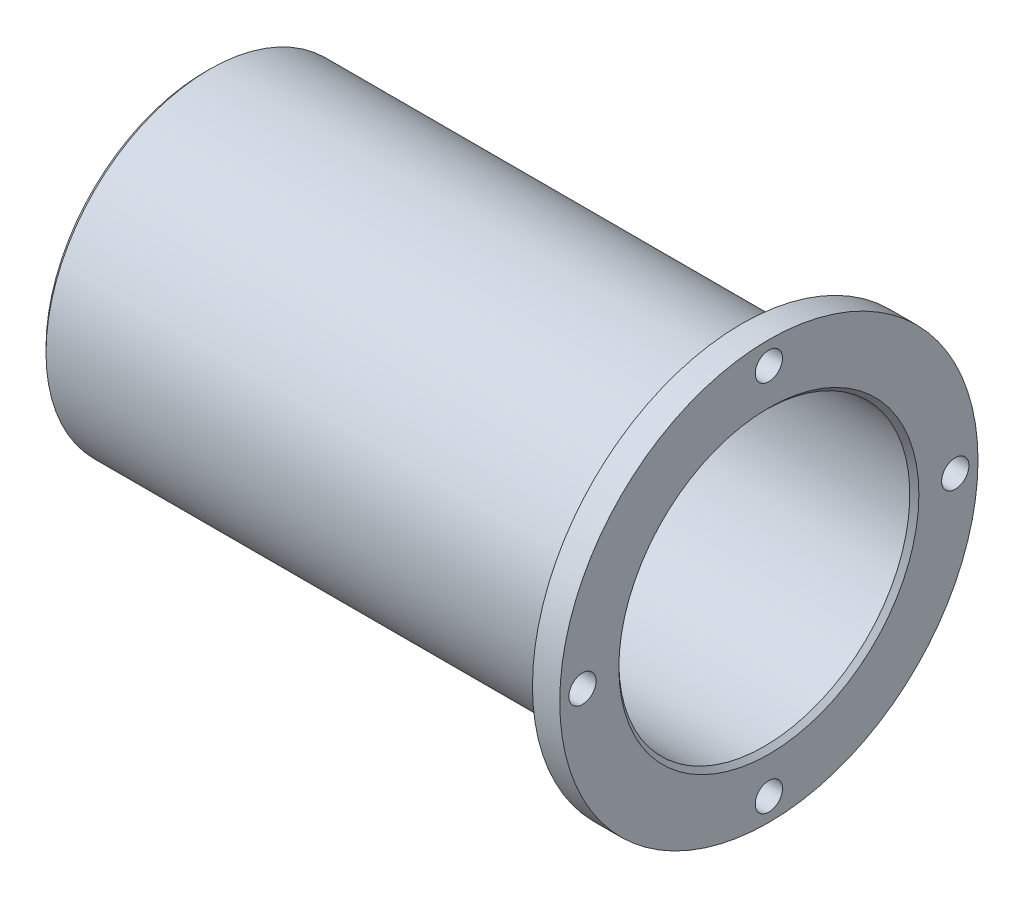
ISO-10303-21;
HEADER;
FILE_DESCRIPTION(('STEP AP214'),'2;1');
FILE_NAME('part.step','',(''),(''),'','','');
FILE_SCHEMA(('AUTOMOTIVE_DESIGN { 1 0 10303 214 1 1 1 1 }'));
ENDSEC;
DATA;
#1=APPLICATION_CONTEXT('core data for automotive mechanical design processes');
#2=APPLICATION_PROTOCOL_DEFINITION('international standard','automotive_design',2000,#1);
#3=PRODUCT_CONTEXT('',#1,'mechanical');
#4=PRODUCT('Part','Part','',(#3));
#5=PRODUCT_RELATED_PRODUCT_CATEGORY('part','',(#4));
#6=PRODUCT_DEFINITION_FORMATION('','',#4);
#7=PRODUCT_DEFINITION_CONTEXT('part definition',#1,'design');
#8=PRODUCT_DEFINITION('design','',#6,#7);
#9=PRODUCT_DEFINITION_SHAPE('','',#8);
#10=(LENGTH_UNIT() NAMED_UNIT(*) SI_UNIT(.MILLI.,.METRE.));
#11=(NAMED_UNIT(*) PLANE_ANGLE_UNIT() SI_UNIT($,.RADIAN.));
#12=(NAMED_UNIT(*) SI_UNIT($,.STERADIAN.) SOLID_ANGLE_UNIT());
#13=UNCERTAINTY_MEASURE_WITH_UNIT(LENGTH_MEASURE(1.E-05),#10,'distance_accuracy_value','');
#14=(GEOMETRIC_REPRESENTATION_CONTEXT(3) GLOBAL_UNCERTAINTY_ASSIGNED_CONTEXT((#13)) GLOBAL_UNIT_ASSIGNED_CONTEXT((#10,
#11,#12)) REPRESENTATION_CONTEXT('',''));
#15=CARTESIAN_POINT('',(0.,0.,0.));
#16=DIRECTION('',(0.,0.,1.));
#17=DIRECTION('',(1.,0.,0.));
#18=AXIS2_PLACEMENT_3D('',#15,#16,#17);
#19=CARTESIAN_POINT('',(-69.9562314889052,0.,0.));
#20=DIRECTION('',(-1.,0.,0.));
#21=DIRECTION('',(0.,0.,1.));
#22=AXIS2_PLACEMENT_3D('',#19,#20,#21);
#23=CYLINDRICAL_SURFACE('',#22,18.);
#24=CARTESIAN_POINT('',(-61.5,0.,0.));
#25=DIRECTION('',(1.,0.,0.));
#26=DIRECTION('',(0.,0.,-1.));
#27=AXIS2_PLACEMENT_3D('',#24,#25,#26);
#28=CIRCLE('',#27,18.);
#29=CARTESIAN_POINT('',(-61.5,0.,-18.));
#30=VERTEX_POINT('',#29);
#31=EDGE_CURVE('E10',#30,#30,#28,.T.);
#32=ORIENTED_EDGE('',*,*,#31,.T.);
#33=EDGE_LOOP('',(#32));
#34=FACE_BOUND('',#33,.T.);
#35=CARTESIAN_POINT('',(-3.,0.,0.));
#36=DIRECTION('',(-1.,0.,0.));
#37=DIRECTION('',(0.,0.,1.));
#38=AXIS2_PLACEMENT_3D('',#35,#36,#37);
#39=CIRCLE('',#38,18.);
#40=CARTESIAN_POINT('',(-3.,0.,18.));
#41=VERTEX_POINT('',#40);
#42=EDGE_CURVE('E92',#41,#41,#39,.T.);
#43=ORIENTED_EDGE('',*,*,#42,.T.);
#44=EDGE_LOOP('',(#43));
#45=FACE_BOUND('',#44,.T.);
#46=ADVANCED_FACE('F33',(#34,#45),#23,.T.);
#47=CARTESIAN_POINT('',(-62.,18.,0.));
#48=DIRECTION('',(1.,0.,0.));
#49=DIRECTION('',(0.,0.,-1.));
#50=AXIS2_PLACEMENT_3D('',#47,#48,#49);
#51=PLANE('',#50);
#52=CARTESIAN_POINT('',(-62.,0.,0.));
#53=DIRECTION('',(1.,0.,0.));
#54=DIRECTION('',(0.,0.,-1.));
#55=AXIS2_PLACEMENT_3D('',#52,#53,#54);
#56=CIRCLE('',#55,17.5);
#57=CARTESIAN_POINT('',(-62.,0.,-17.5));
#58=VERTEX_POINT('',#57);
#59=EDGE_CURVE('E40',#58,#58,#56,.F.);
#60=ORIENTED_EDGE('',*,*,#59,.T.);
#61=EDGE_LOOP('',(#60));
#62=FACE_BOUND('',#61,.T.);
#63=CARTESIAN_POINT('',(-62.,-13.,0.));
#64=DIRECTION('',(1.,0.,0.));
#65=DIRECTION('',(0.,0.,-1.));
#66=AXIS2_PLACEMENT_3D('',#63,#64,#65);
#67=CIRCLE('',#66,2.99999999999999);
#68=CARTESIAN_POINT('',(-62.,-13.,-2.99999999999999));
#69=VERTEX_POINT('',#68);
#70=EDGE_CURVE('E62',#69,#69,#67,.T.);
#71=ORIENTED_EDGE('',*,*,#70,.T.);
#72=EDGE_LOOP('',(#71));
#73=FACE_BOUND('',#72,.T.);
#74=CARTESIAN_POINT('',(-62.,0.,13.));
#75=DIRECTION('',(1.,0.,0.));
#76=DIRECTION('',(0.,0.,-1.));
#77=AXIS2_PLACEMENT_3D('',#74,#75,#76);
#78=CIRCLE('',#77,2.99999999999999);
#79=CARTESIAN_POINT('',(-62.,0.,10.));
#80=VERTEX_POINT('',#79);
#81=EDGE_CURVE('E65',#80,#80,#78,.T.);
#82=ORIENTED_EDGE('',*,*,#81,.T.);
#83=EDGE_LOOP('',(#82));
#84=FACE_BOUND('',#83,.T.);
#85=CARTESIAN_POINT('',(-62.,13.,0.));
#86=DIRECTION('',(1.,0.,0.));
#87=DIRECTION('',(0.,0.,-1.));
#88=AXIS2_PLACEMENT_3D('',#85,#86,#87);
#89=CIRCLE('',#88,2.99999999999999);
#90=CARTESIAN_POINT('',(-62.,13.,-2.99999999999999));
#91=VERTEX_POINT('',#90);
#92=EDGE_CURVE('E68',#91,#91,#89,.T.);
#93=ORIENTED_EDGE('',*,*,#92,.T.);
#94=EDGE_LOOP('',(#93));
#95=FACE_BOUND('',#94,.T.);
#96=CARTESIAN_POINT('',(-62.,0.,-13.));
#97=DIRECTION('',(1.,0.,0.));
#98=DIRECTION('',(0.,0.,-1.));
#99=AXIS2_PLACEMENT_3D('',#96,#97,#98);
#100=CIRCLE('',#99,2.99999999999999);
#101=CARTESIAN_POINT('',(-62.,0.,-16.));
#102=VERTEX_POINT('',#101);
#103=EDGE_CURVE('E71',#102,#102,#100,.T.);
#104=ORIENTED_EDGE('',*,*,#103,.T.);
#105=EDGE_LOOP('',(#104));
#106=FACE_BOUND('',#105,.T.);
#107=CARTESIAN_POINT('',(-62.,0.,0.));
#108=DIRECTION('',(-1.,0.,0.));
#109=DIRECTION('',(0.,0.,1.));
#110=AXIS2_PLACEMENT_3D('',#107,#108,#109);
#111=CIRCLE('',#110,9.5);
#112=CARTESIAN_POINT('',(-62.,0.,9.5));
#113=VERTEX_POINT('',#112);
#114=EDGE_CURVE('E77',#113,#113,#111,.T.);
#115=ORIENTED_EDGE('',*,*,#114,.F.);
#116=EDGE_LOOP('',(#115));
#117=FACE_BOUND('',#116,.T.);
#118=ADVANCED_FACE('F162',(#62,#73,#84,#95,#106,#117),#51,.F.);
#119=CARTESIAN_POINT('',(-69.9562314889052,0.,0.));
#120=DIRECTION('',(-1.,0.,0.));
#121=DIRECTION('',(0.,0.,1.));
#122=AXIS2_PLACEMENT_3D('',#119,#120,#121);
#123=CYLINDRICAL_SURFACE('',#122,9.5);
#124=CARTESIAN_POINT('',(-60.,0.,0.));
#125=DIRECTION('',(-1.,0.,0.));
#126=DIRECTION('',(0.,0.,1.));
#127=AXIS2_PLACEMENT_3D('',#124,#125,#126);
#128=CIRCLE('',#127,9.5);
#129=CARTESIAN_POINT('',(-60.,0.,9.5));
#130=VERTEX_POINT('',#129);
#131=EDGE_CURVE('E80',#130,#130,#128,.T.);
#132=ORIENTED_EDGE('',*,*,#131,.F.);
#133=EDGE_LOOP('',(#132));
#134=FACE_BOUND('',#133,.T.);
#135=ORIENTED_EDGE('',*,*,#114,.T.);
#136=EDGE_LOOP('',(#135));
#137=FACE_BOUND('',#136,.T.);
#138=ADVANCED_FACE('F167',(#134,#137),#123,.F.);
#139=CARTESIAN_POINT('',(-60.,16.,0.));
#140=DIRECTION('',(-1.,0.,0.));
#141=DIRECTION('',(0.,0.,1.));
#142=AXIS2_PLACEMENT_3D('',#139,#140,#141);
#143=PLANE('',#142);
#144=CARTESIAN_POINT('',(-60.,13.,0.));
#145=DIRECTION('',(-1.,0.,0.));
#146=DIRECTION('',(0.,0.,1.));
#147=AXIS2_PLACEMENT_3D('',#144,#145,#146);
#148=CIRCLE('',#147,1.5);
#149=CARTESIAN_POINT('',(-60.,13.,1.5));
#150=VERTEX_POINT('',#149);
#151=EDGE_CURVE('E95',#150,#150,#148,.F.);
#152=ORIENTED_EDGE('',*,*,#151,.F.);
#153=EDGE_LOOP('',(#152));
#154=FACE_BOUND('',#153,.T.);
#155=CARTESIAN_POINT('',(-60.,0.,13.));
#156=DIRECTION('',(-1.,0.,0.));
#157=DIRECTION('',(0.,0.,1.));
#158=AXIS2_PLACEMENT_3D('',#155,#156,#157);
#159=CIRCLE('',#158,1.5);
#160=CARTESIAN_POINT('',(-60.,0.,14.5));
#161=VERTEX_POINT('',#160);
#162=EDGE_CURVE('E103',#161,#161,#159,.F.);
#163=ORIENTED_EDGE('',*,*,#162,.F.);
#164=EDGE_LOOP('',(#163));
#165=FACE_BOUND('',#164,.T.);
#166=CARTESIAN_POINT('',(-60.,-13.,0.));
#167=DIRECTION('',(-1.,0.,0.));
#168=DIRECTION('',(0.,0.,1.));
#169=AXIS2_PLACEMENT_3D('',#166,#167,#168);
#170=CIRCLE('',#169,1.5);
#171=CARTESIAN_POINT('',(-60.,-13.,1.5));
#172=VERTEX_POINT('',#171);
#173=EDGE_CURVE('E99',#172,#172,#170,.F.);
#174=ORIENTED_EDGE('',*,*,#173,.F.);
#175=EDGE_LOOP('',(#174));
#176=FACE_BOUND('',#175,.T.);
#177=CARTESIAN_POINT('',(-60.,0.,-13.));
#178=DIRECTION('',(-1.,0.,0.));
#179=DIRECTION('',(0.,0.,1.));
#180=AXIS2_PLACEMENT_3D('',#177,#178,#179);
#181=CIRCLE('',#180,1.5);
#182=CARTESIAN_POINT('',(-60.,0.,-11.5));
#183=VERTEX_POINT('',#182);
#184=EDGE_CURVE('E96',#183,#183,#181,.F.);
#185=ORIENTED_EDGE('',*,*,#184,.F.);
#186=EDGE_LOOP('',(#185));
#187=FACE_BOUND('',#186,.T.);
#188=CARTESIAN_POINT('',(-60.,0.,0.));
#189=DIRECTION('',(-1.,0.,0.));
#190=DIRECTION('',(0.,0.,1.));
#191=AXIS2_PLACEMENT_3D('',#188,#189,#190);
#192=CIRCLE('',#191,16.);
#193=CARTESIAN_POINT('',(-60.,0.,16.));
#194=VERTEX_POINT('',#193);
#195=EDGE_CURVE('E83',#194,#194,#192,.T.);
#196=ORIENTED_EDGE('',*,*,#195,.F.);
#197=EDGE_LOOP('',(#196));
#198=FACE_BOUND('',#197,.T.);
#199=ORIENTED_EDGE('',*,*,#131,.T.);
#200=EDGE_LOOP('',(#199));
#201=FACE_BOUND('',#200,.T.);
#202=ADVANCED_FACE('F205',(#154,#165,#176,#187,#198,#201),#143,.F.);
#203=CARTESIAN_POINT('',(-69.9562314889052,0.,0.));
#204=DIRECTION('',(-1.,0.,0.));
#205=DIRECTION('',(0.,0.,1.));
#206=AXIS2_PLACEMENT_3D('',#203,#204,#205);
#207=CYLINDRICAL_SURFACE('',#206,16.);
#208=CARTESIAN_POINT('',(-0.499999999999987,0.,0.));
#209=DIRECTION('',(-1.,0.,0.));
#210=DIRECTION('',(0.,0.,1.));
#211=AXIS2_PLACEMENT_3D('',#208,#209,#210);
#212=CIRCLE('',#211,16.);
#213=CARTESIAN_POINT('',(-0.499999999999987,0.,16.));
#214=VERTEX_POINT('',#213);
#215=EDGE_CURVE('E44',#214,#214,#212,.F.);
#216=ORIENTED_EDGE('',*,*,#215,.T.);
#217=EDGE_LOOP('',(#216));
#218=FACE_BOUND('',#217,.T.);
#219=ORIENTED_EDGE('',*,*,#195,.T.);
#220=EDGE_LOOP('',(#219));
#221=FACE_BOUND('',#220,.T.);
#222=ADVANCED_FACE('F139',(#218,#221),#207,.F.);
#223=CARTESIAN_POINT('',(0.,23.,0.));
#224=DIRECTION('',(-1.,0.,0.));
#225=DIRECTION('',(0.,0.,1.));
#226=AXIS2_PLACEMENT_3D('',#223,#224,#225);
#227=PLANE('',#226);
#228=CARTESIAN_POINT('',(0.,0.,0.));
#229=DIRECTION('',(-1.,0.,0.));
#230=DIRECTION('',(0.,0.,1.));
#231=AXIS2_PLACEMENT_3D('',#228,#229,#230);
#232=CIRCLE('',#231,16.5);
#233=CARTESIAN_POINT('',(0.,0.,16.5));
#234=VERTEX_POINT('',#233);
#235=EDGE_CURVE('E48',#234,#234,#232,.T.);
#236=ORIENTED_EDGE('',*,*,#235,.T.);
#237=EDGE_LOOP('',(#236));
#238=FACE_BOUND('',#237,.T.);
#239=CARTESIAN_POINT('',(0.,20.5,0.));
#240=DIRECTION('',(1.,0.,0.));
#241=DIRECTION('',(0.,0.,-1.));
#242=AXIS2_PLACEMENT_3D('',#239,#240,#241);
#243=CIRCLE('',#242,1.5);
#244=CARTESIAN_POINT('',(0.,20.5,-1.5));
#245=VERTEX_POINT('',#244);
#246=EDGE_CURVE('E124',#245,#245,#243,.T.);
#247=ORIENTED_EDGE('',*,*,#246,.F.);
#248=EDGE_LOOP('',(#247));
#249=FACE_BOUND('',#248,.T.);
#250=CARTESIAN_POINT('',(0.,0.,-20.5));
#251=DIRECTION('',(1.,0.,0.));
#252=DIRECTION('',(0.,0.,-1.));
#253=AXIS2_PLACEMENT_3D('',#250,#251,#252);
#254=CIRCLE('',#253,1.5);
#255=CARTESIAN_POINT('',(0.,0.,-22.));
#256=VERTEX_POINT('',#255);
#257=EDGE_CURVE('E118',#256,#256,#254,.T.);
#258=ORIENTED_EDGE('',*,*,#257,.F.);
#259=EDGE_LOOP('',(#258));
#260=FACE_BOUND('',#259,.T.);
#261=CARTESIAN_POINT('',(0.,-20.5,0.));
#262=DIRECTION('',(1.,0.,0.));
#263=DIRECTION('',(0.,0.,-1.));
#264=AXIS2_PLACEMENT_3D('',#261,#262,#263);
#265=CIRCLE('',#264,1.5);
#266=CARTESIAN_POINT('',(0.,-20.5,-1.5));
#267=VERTEX_POINT('',#266);
#268=EDGE_CURVE('E111',#267,#267,#265,.T.);
#269=ORIENTED_EDGE('',*,*,#268,.F.);
#270=EDGE_LOOP('',(#269));
#271=FACE_BOUND('',#270,.T.);
#272=CARTESIAN_POINT('',(0.,0.,20.5));
#273=DIRECTION('',(1.,0.,0.));
#274=DIRECTION('',(0.,0.,-1.));
#275=AXIS2_PLACEMENT_3D('',#272,#273,#274);
#276=CIRCLE('',#275,1.5);
#277=CARTESIAN_POINT('',(0.,0.,19.));
#278=VERTEX_POINT('',#277);
#279=EDGE_CURVE('E112',#278,#278,#276,.T.);
#280=ORIENTED_EDGE('',*,*,#279,.F.);
#281=EDGE_LOOP('',(#280));
#282=FACE_BOUND('',#281,.T.);
#283=CARTESIAN_POINT('',(0.,0.,0.));
#284=DIRECTION('',(-1.,0.,0.));
#285=DIRECTION('',(0.,0.,1.));
#286=AXIS2_PLACEMENT_3D('',#283,#284,#285);
#287=CIRCLE('',#286,23.);
#288=CARTESIAN_POINT('',(0.,0.,23.));
#289=VERTEX_POINT('',#288);
#290=EDGE_CURVE('E86',#289,#289,#287,.T.);
#291=ORIENTED_EDGE('',*,*,#290,.F.);
#292=EDGE_LOOP('',(#291));
#293=FACE_BOUND('',#292,.T.);
#294=ADVANCED_FACE('F135',(#238,#249,#260,#271,#282,#293),#227,.F.);
#295=CARTESIAN_POINT('',(-69.9562314889052,0.,0.));
#296=DIRECTION('',(-1.,0.,0.));
#297=DIRECTION('',(0.,0.,1.));
#298=AXIS2_PLACEMENT_3D('',#295,#296,#297);
#299=CYLINDRICAL_SURFACE('',#298,23.);
#300=CARTESIAN_POINT('',(-3.,0.,0.));
#301=DIRECTION('',(-1.,0.,0.));
#302=DIRECTION('',(0.,0.,1.));
#303=AXIS2_PLACEMENT_3D('',#300,#301,#302);
#304=CIRCLE('',#303,23.);
#305=CARTESIAN_POINT('',(-3.,0.,23.));
#306=VERTEX_POINT('',#305);
#307=EDGE_CURVE('E89',#306,#306,#304,.T.);
#308=ORIENTED_EDGE('',*,*,#307,.F.);
#309=EDGE_LOOP('',(#308));
#310=FACE_BOUND('',#309,.T.);
#311=ORIENTED_EDGE('',*,*,#290,.T.);
#312=EDGE_LOOP('',(#311));
#313=FACE_BOUND('',#312,.T.);
#314=ADVANCED_FACE('F138',(#310,#313),#299,.T.);
#315=CARTESIAN_POINT('',(-3.,18.,0.));
#316=DIRECTION('',(1.,0.,0.));
#317=DIRECTION('',(0.,0.,-1.));
#318=AXIS2_PLACEMENT_3D('',#315,#316,#317);
#319=PLANE('',#318);
#320=CARTESIAN_POINT('',(-3.,20.5,0.));
#321=DIRECTION('',(1.,0.,0.));
#322=DIRECTION('',(0.,0.,-1.));
#323=AXIS2_PLACEMENT_3D('',#320,#321,#322);
#324=CIRCLE('',#323,1.5);
#325=CARTESIAN_POINT('',(-3.,20.5,-1.5));
#326=VERTEX_POINT('',#325);
#327=EDGE_CURVE('E100',#326,#326,#324,.F.);
#328=ORIENTED_EDGE('',*,*,#327,.F.);
#329=EDGE_LOOP('',(#328));
#330=FACE_BOUND('',#329,.T.);
#331=CARTESIAN_POINT('',(-3.,0.,-20.5));
#332=DIRECTION('',(1.,0.,0.));
#333=DIRECTION('',(0.,0.,-1.));
#334=AXIS2_PLACEMENT_3D('',#331,#332,#333);
#335=CIRCLE('',#334,1.5);
#336=CARTESIAN_POINT('',(-3.,0.,-22.));
#337=VERTEX_POINT('',#336);
#338=EDGE_CURVE('E121',#337,#337,#335,.F.);
#339=ORIENTED_EDGE('',*,*,#338,.F.);
#340=EDGE_LOOP('',(#339));
#341=FACE_BOUND('',#340,.T.);
#342=CARTESIAN_POINT('',(-3.,-20.5,0.));
#343=DIRECTION('',(1.,0.,0.));
#344=DIRECTION('',(0.,0.,-1.));
#345=AXIS2_PLACEMENT_3D('',#342,#343,#344);
#346=CIRCLE('',#345,1.5);
#347=CARTESIAN_POINT('',(-3.,-20.5,-1.5));
#348=VERTEX_POINT('',#347);
#349=EDGE_CURVE('E115',#348,#348,#346,.F.);
#350=ORIENTED_EDGE('',*,*,#349,.F.);
#351=EDGE_LOOP('',(#350));
#352=FACE_BOUND('',#351,.T.);
#353=CARTESIAN_POINT('',(-3.,0.,20.5));
#354=DIRECTION('',(1.,0.,0.));
#355=DIRECTION('',(0.,0.,-1.));
#356=AXIS2_PLACEMENT_3D('',#353,#354,#355);
#357=CIRCLE('',#356,1.5);
#358=CARTESIAN_POINT('',(-3.,0.,19.));
#359=VERTEX_POINT('',#358);
#360=EDGE_CURVE('E108',#359,#359,#357,.F.);
#361=ORIENTED_EDGE('',*,*,#360,.F.);
#362=EDGE_LOOP('',(#361));
#363=FACE_BOUND('',#362,.T.);
#364=ORIENTED_EDGE('',*,*,#42,.F.);
#365=EDGE_LOOP('',(#364));
#366=FACE_BOUND('',#365,.T.);
#367=ORIENTED_EDGE('',*,*,#307,.T.);
#368=EDGE_LOOP('',(#367));
#369=FACE_BOUND('',#368,.T.);
#370=ADVANCED_FACE('F151',(#330,#341,#352,#363,#366,#369),#319,.F.);
#371=CARTESIAN_POINT('',(0.00100000000001488,0.,-13.));
#372=DIRECTION('',(-1.,0.,0.));
#373=DIRECTION('',(0.,0.,1.));
#374=AXIS2_PLACEMENT_3D('',#371,#372,#373);
#375=CYLINDRICAL_SURFACE('',#374,1.5);
#376=CARTESIAN_POINT('',(-60.5,0.,-13.));
#377=DIRECTION('',(1.,0.,0.));
#378=DIRECTION('',(0.,0.,-1.));
#379=AXIS2_PLACEMENT_3D('',#376,#377,#378);
#380=CIRCLE('',#379,1.5);
#381=CARTESIAN_POINT('',(-60.5,0.,-14.5));
#382=VERTEX_POINT('',#381);
#383=EDGE_CURVE('E53',#382,#382,#380,.F.);
#384=ORIENTED_EDGE('',*,*,#383,.T.);
#385=EDGE_LOOP('',(#384));
#386=FACE_BOUND('',#385,.T.);
#387=ORIENTED_EDGE('',*,*,#184,.T.);
#388=EDGE_LOOP('',(#387));
#389=FACE_BOUND('',#388,.T.);
#390=ADVANCED_FACE('F157',(#386,#389),#375,.F.);
#391=CARTESIAN_POINT('',(0.00100000000001488,-13.,0.));
#392=DIRECTION('',(-1.,0.,0.));
#393=DIRECTION('',(0.,0.,1.));
#394=AXIS2_PLACEMENT_3D('',#391,#392,#393);
#395=CYLINDRICAL_SURFACE('',#394,1.5);
#396=CARTESIAN_POINT('',(-60.5,-13.,0.));
#397=DIRECTION('',(1.,0.,0.));
#398=DIRECTION('',(0.,0.,-1.));
#399=AXIS2_PLACEMENT_3D('',#396,#397,#398);
#400=CIRCLE('',#399,1.5);
#401=CARTESIAN_POINT('',(-60.5,-13.,-1.5));
#402=VERTEX_POINT('',#401);
#403=EDGE_CURVE('E74',#402,#402,#400,.F.);
#404=ORIENTED_EDGE('',*,*,#403,.T.);
#405=EDGE_LOOP('',(#404));
#406=FACE_BOUND('',#405,.T.);
#407=ORIENTED_EDGE('',*,*,#173,.T.);
#408=EDGE_LOOP('',(#407));
#409=FACE_BOUND('',#408,.T.);
#410=ADVANCED_FACE('F317',(#406,#409),#395,.F.);
#411=CARTESIAN_POINT('',(0.00100000000001488,0.,13.));
#412=DIRECTION('',(-1.,0.,0.));
#413=DIRECTION('',(0.,0.,1.));
#414=AXIS2_PLACEMENT_3D('',#411,#412,#413);
#415=CYLINDRICAL_SURFACE('',#414,1.5);
#416=CARTESIAN_POINT('',(-60.5,0.,13.));
#417=DIRECTION('',(1.,0.,0.));
#418=DIRECTION('',(0.,0.,-1.));
#419=AXIS2_PLACEMENT_3D('',#416,#417,#418);
#420=CIRCLE('',#419,1.5);
#421=CARTESIAN_POINT('',(-60.5,0.,11.5));
#422=VERTEX_POINT('',#421);
#423=EDGE_CURVE('E59',#422,#422,#420,.F.);
#424=ORIENTED_EDGE('',*,*,#423,.T.);
#425=EDGE_LOOP('',(#424));
#426=FACE_BOUND('',#425,.T.);
#427=ORIENTED_EDGE('',*,*,#162,.T.);
#428=EDGE_LOOP('',(#427));
#429=FACE_BOUND('',#428,.T.);
#430=ADVANCED_FACE('F308',(#426,#429),#415,.F.);
#431=CARTESIAN_POINT('',(0.00100000000001488,13.,0.));
#432=DIRECTION('',(-1.,0.,0.));
#433=DIRECTION('',(0.,0.,1.));
#434=AXIS2_PLACEMENT_3D('',#431,#432,#433);
#435=CYLINDRICAL_SURFACE('',#434,1.5);
#436=CARTESIAN_POINT('',(-60.5,13.,0.));
#437=DIRECTION('',(1.,0.,0.));
#438=DIRECTION('',(0.,0.,-1.));
#439=AXIS2_PLACEMENT_3D('',#436,#437,#438);
#440=CIRCLE('',#439,1.5);
#441=CARTESIAN_POINT('',(-60.5,13.,-1.5));
#442=VERTEX_POINT('',#441);
#443=EDGE_CURVE('E56',#442,#442,#440,.F.);
#444=ORIENTED_EDGE('',*,*,#443,.T.);
#445=EDGE_LOOP('',(#444));
#446=FACE_BOUND('',#445,.T.);
#447=ORIENTED_EDGE('',*,*,#151,.T.);
#448=EDGE_LOOP('',(#447));
#449=FACE_BOUND('',#448,.T.);
#450=ADVANCED_FACE('F176',(#446,#449),#435,.F.);
#451=CARTESIAN_POINT('',(-60.5,-13.,0.));
#452=DIRECTION('',(-1.,0.,0.));
#453=DIRECTION('',(0.,0.,1.));
#454=AXIS2_PLACEMENT_3D('',#451,#452,#453);
#455=CONICAL_SURFACE('',#454,1.5,0.785398163397455);
#456=ORIENTED_EDGE('',*,*,#70,.F.);
#457=EDGE_LOOP('',(#456));
#458=FACE_BOUND('',#457,.T.);
#459=ORIENTED_EDGE('',*,*,#403,.F.);
#460=EDGE_LOOP('',(#459));
#461=FACE_BOUND('',#460,.T.);
#462=ADVANCED_FACE('F172',(#458,#461),#455,.F.);
#463=CARTESIAN_POINT('',(-60.5,0.,13.));
#464=DIRECTION('',(-1.,0.,0.));
#465=DIRECTION('',(0.,0.,1.));
#466=AXIS2_PLACEMENT_3D('',#463,#464,#465);
#467=CONICAL_SURFACE('',#466,1.5,0.785398163397454);
#468=ORIENTED_EDGE('',*,*,#81,.F.);
#469=EDGE_LOOP('',(#468));
#470=FACE_BOUND('',#469,.T.);
#471=ORIENTED_EDGE('',*,*,#423,.F.);
#472=EDGE_LOOP('',(#471));
#473=FACE_BOUND('',#472,.T.);
#474=ADVANCED_FACE('F175',(#470,#473),#467,.F.);
#475=CARTESIAN_POINT('',(-60.5,13.,0.));
#476=DIRECTION('',(-1.,0.,0.));
#477=DIRECTION('',(0.,0.,1.));
#478=AXIS2_PLACEMENT_3D('',#475,#476,#477);
#479=CONICAL_SURFACE('',#478,1.5,0.785398163397456);
#480=ORIENTED_EDGE('',*,*,#92,.F.);
#481=EDGE_LOOP('',(#480));
#482=FACE_BOUND('',#481,.T.);
#483=ORIENTED_EDGE('',*,*,#443,.F.);
#484=EDGE_LOOP('',(#483));
#485=FACE_BOUND('',#484,.T.);
#486=ADVANCED_FACE('F180',(#482,#485),#479,.F.);
#487=CARTESIAN_POINT('',(-60.5,0.,-13.));
#488=DIRECTION('',(-1.,0.,0.));
#489=DIRECTION('',(0.,0.,1.));
#490=AXIS2_PLACEMENT_3D('',#487,#488,#489);
#491=CONICAL_SURFACE('',#490,1.5,0.785398163397454);
#492=ORIENTED_EDGE('',*,*,#103,.F.);
#493=EDGE_LOOP('',(#492));
#494=FACE_BOUND('',#493,.T.);
#495=ORIENTED_EDGE('',*,*,#383,.F.);
#496=EDGE_LOOP('',(#495));
#497=FACE_BOUND('',#496,.T.);
#498=ADVANCED_FACE('F184',(#494,#497),#491,.F.);
#499=CARTESIAN_POINT('',(-62.001,0.,20.5));
#500=DIRECTION('',(1.,0.,0.));
#501=DIRECTION('',(0.,0.,-1.));
#502=AXIS2_PLACEMENT_3D('',#499,#500,#501);
#503=CYLINDRICAL_SURFACE('',#502,1.5);
#504=ORIENTED_EDGE('',*,*,#279,.T.);
#505=EDGE_LOOP('',(#504));
#506=FACE_BOUND('',#505,.T.);
#507=ORIENTED_EDGE('',*,*,#360,.T.);
#508=EDGE_LOOP('',(#507));
#509=FACE_BOUND('',#508,.T.);
#510=ADVANCED_FACE('F187',(#506,#509),#503,.F.);
#511=CARTESIAN_POINT('',(-62.001,-20.5,0.));
#512=DIRECTION('',(1.,0.,0.));
#513=DIRECTION('',(0.,0.,-1.));
#514=AXIS2_PLACEMENT_3D('',#511,#512,#513);
#515=CYLINDRICAL_SURFACE('',#514,1.5);
#516=ORIENTED_EDGE('',*,*,#268,.T.);
#517=EDGE_LOOP('',(#516));
#518=FACE_BOUND('',#517,.T.);
#519=ORIENTED_EDGE('',*,*,#349,.T.);
#520=EDGE_LOOP('',(#519));
#521=FACE_BOUND('',#520,.T.);
#522=ADVANCED_FACE('F262',(#518,#521),#515,.F.);
#523=CARTESIAN_POINT('',(-62.001,0.,-20.5));
#524=DIRECTION('',(1.,0.,0.));
#525=DIRECTION('',(0.,0.,-1.));
#526=AXIS2_PLACEMENT_3D('',#523,#524,#525);
#527=CYLINDRICAL_SURFACE('',#526,1.5);
#528=ORIENTED_EDGE('',*,*,#257,.T.);
#529=EDGE_LOOP('',(#528));
#530=FACE_BOUND('',#529,.T.);
#531=ORIENTED_EDGE('',*,*,#338,.T.);
#532=EDGE_LOOP('',(#531));
#533=FACE_BOUND('',#532,.T.);
#534=ADVANCED_FACE('F197',(#530,#533),#527,.F.);
#535=CARTESIAN_POINT('',(-62.001,20.5,0.));
#536=DIRECTION('',(1.,0.,0.));
#537=DIRECTION('',(0.,0.,-1.));
#538=AXIS2_PLACEMENT_3D('',#535,#536,#537);
#539=CYLINDRICAL_SURFACE('',#538,1.5);
#540=ORIENTED_EDGE('',*,*,#246,.T.);
#541=EDGE_LOOP('',(#540));
#542=FACE_BOUND('',#541,.T.);
#543=ORIENTED_EDGE('',*,*,#327,.T.);
#544=EDGE_LOOP('',(#543));
#545=FACE_BOUND('',#544,.T.);
#546=ADVANCED_FACE('F132',(#542,#545),#539,.F.);
#547=CARTESIAN_POINT('',(0.,0.,0.));
#548=DIRECTION('',(1.,0.,0.));
#549=DIRECTION('',(0.,0.,-1.));
#550=AXIS2_PLACEMENT_3D('',#547,#548,#549);
#551=CONICAL_SURFACE('',#550,16.5,0.785398163397441);
#552=ORIENTED_EDGE('',*,*,#215,.F.);
#553=EDGE_LOOP('',(#552));
#554=FACE_BOUND('',#553,.T.);
#555=ORIENTED_EDGE('',*,*,#235,.F.);
#556=EDGE_LOOP('',(#555));
#557=FACE_BOUND('',#556,.T.);
#558=ADVANCED_FACE('F189',(#554,#557),#551,.F.);
#559=CARTESIAN_POINT('',(-62.,0.,0.));
#560=DIRECTION('',(1.,0.,0.));
#561=DIRECTION('',(0.,0.,-1.));
#562=AXIS2_PLACEMENT_3D('',#559,#560,#561);
#563=CONICAL_SURFACE('',#562,17.5,0.785398163397445);
#564=ORIENTED_EDGE('',*,*,#31,.F.);
#565=EDGE_LOOP('',(#564));
#566=FACE_BOUND('',#565,.T.);
#567=ORIENTED_EDGE('',*,*,#59,.F.);
#568=EDGE_LOOP('',(#567));
#569=FACE_BOUND('',#568,.T.);
#570=ADVANCED_FACE('F35',(#566,#569),#563,.T.);
#571=CLOSED_SHELL('',(#46,#118,#138,#202,#222,#294,#314,#370,#390,#410,#430,#450,#462,#474,#486,
#498,#510,#522,#534,#546,#558,#570));
#572=MANIFOLD_SOLID_BREP('B2',#571);
#573=ADVANCED_BREP_SHAPE_REPRESENTATION('',(#18,#572),#14);
#574=SHAPE_DEFINITION_REPRESENTATION(#9,#573);
ENDSEC;
END-ISO-10303-21;
